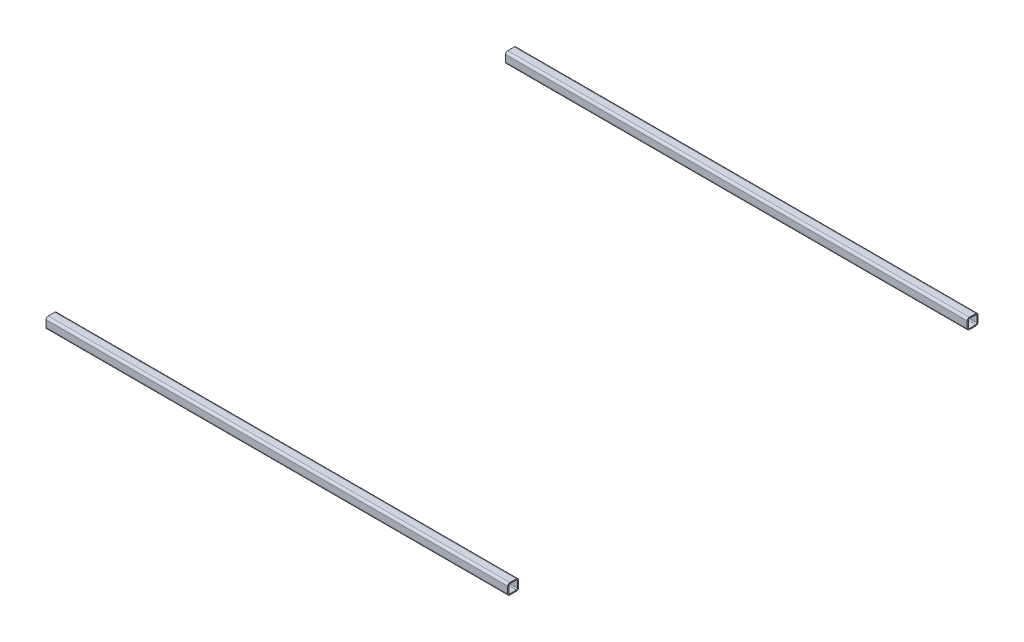
ISO-10303-21;
HEADER;
FILE_DESCRIPTION(('STEP AP214'),'2;1');
FILE_NAME('part.step','',(''),(''),'','','');
FILE_SCHEMA(('AUTOMOTIVE_DESIGN { 1 0 10303 214 1 1 1 1 }'));
ENDSEC;
DATA;
#1=APPLICATION_CONTEXT('core data for automotive mechanical design processes');
#2=APPLICATION_PROTOCOL_DEFINITION('international standard','automotive_design',2000,#1);
#3=PRODUCT_CONTEXT('',#1,'mechanical');
#4=PRODUCT('Part','Part','',(#3));
#5=PRODUCT_RELATED_PRODUCT_CATEGORY('part','',(#4));
#6=PRODUCT_DEFINITION_FORMATION('','',#4);
#7=PRODUCT_DEFINITION_CONTEXT('part definition',#1,'design');
#8=PRODUCT_DEFINITION('design','',#6,#7);
#9=PRODUCT_DEFINITION_SHAPE('','',#8);
#10=(LENGTH_UNIT() NAMED_UNIT(*) SI_UNIT(.MILLI.,.METRE.));
#11=(NAMED_UNIT(*) PLANE_ANGLE_UNIT() SI_UNIT($,.RADIAN.));
#12=(NAMED_UNIT(*) SI_UNIT($,.STERADIAN.) SOLID_ANGLE_UNIT());
#13=UNCERTAINTY_MEASURE_WITH_UNIT(LENGTH_MEASURE(1.E-05),#10,'distance_accuracy_value','');
#14=(GEOMETRIC_REPRESENTATION_CONTEXT(3) GLOBAL_UNCERTAINTY_ASSIGNED_CONTEXT((#13)) GLOBAL_UNIT_ASSIGNED_CONTEXT((#10,
#11,#12)) REPRESENTATION_CONTEXT('',''));
#15=CARTESIAN_POINT('',(0.,0.,0.));
#16=DIRECTION('',(0.,0.,1.));
#17=DIRECTION('',(1.,0.,0.));
#18=AXIS2_PLACEMENT_3D('',#15,#16,#17);
#19=CARTESIAN_POINT('',(-854.075,12.,862.011));
#20=DIRECTION('',(1.,0.,0.));
#21=DIRECTION('',(0.,0.,-1.));
#22=AXIS2_PLACEMENT_3D('',#19,#20,#21);
#23=CYLINDRICAL_SURFACE('',#22,8.);
#24=CARTESIAN_POINT('',(854.075,12.,862.011));
#25=DIRECTION('',(-1.,0.,0.));
#26=DIRECTION('',(0.,0.,1.));
#27=AXIS2_PLACEMENT_3D('',#24,#25,#26);
#28=CIRCLE('',#27,8.);
#29=CARTESIAN_POINT('',(854.075,12.,870.011));
#30=VERTEX_POINT('',#29);
#31=CARTESIAN_POINT('',(854.075,20.,862.011));
#32=VERTEX_POINT('',#31);
#33=EDGE_CURVE('E256',#30,#32,#28,.T.);
#34=ORIENTED_EDGE('',*,*,#33,.T.);
#35=DIRECTION('',(1.,0.,0.));
#36=VECTOR('',#35,1.);
#37=CARTESIAN_POINT('',(-854.075,20.,862.011));
#38=LINE('',#37,#36);
#39=CARTESIAN_POINT('',(-854.075,20.,862.011));
#40=VERTEX_POINT('',#39);
#41=EDGE_CURVE('E13',#40,#32,#38,.T.);
#42=ORIENTED_EDGE('',*,*,#41,.F.);
#43=CARTESIAN_POINT('',(-854.075,12.,862.011));
#44=DIRECTION('',(-1.,0.,0.));
#45=DIRECTION('',(0.,0.,1.));
#46=AXIS2_PLACEMENT_3D('',#43,#44,#45);
#47=CIRCLE('',#46,8.);
#48=CARTESIAN_POINT('',(-854.075,12.,870.011));
#49=VERTEX_POINT('',#48);
#50=EDGE_CURVE('E348',#49,#40,#47,.T.);
#51=ORIENTED_EDGE('',*,*,#50,.F.);
#52=DIRECTION('',(1.,0.,0.));
#53=VECTOR('',#52,1.);
#54=CARTESIAN_POINT('',(-854.075,12.,870.011));
#55=LINE('',#54,#53);
#56=EDGE_CURVE('E271',#49,#30,#55,.T.);
#57=ORIENTED_EDGE('',*,*,#56,.T.);
#58=EDGE_LOOP('',(#34,#42,#51,#57));
#59=FACE_BOUND('',#58,.T.);
#60=ADVANCED_FACE('F82',(#59),#23,.T.);
#61=CARTESIAN_POINT('',(-854.075,20.,862.011));
#62=DIRECTION('',(0.,-1.,0.));
#63=DIRECTION('',(0.,0.,-1.));
#64=AXIS2_PLACEMENT_3D('',#61,#62,#63);
#65=PLANE('',#64);
#66=DIRECTION('',(0.,0.,-1.));
#67=VECTOR('',#66,1.);
#68=CARTESIAN_POINT('',(854.075,20.,862.011));
#69=LINE('',#68,#67);
#70=CARTESIAN_POINT('',(854.075,20.,838.011));
#71=VERTEX_POINT('',#70);
#72=EDGE_CURVE('E259',#32,#71,#69,.T.);
#73=ORIENTED_EDGE('',*,*,#72,.T.);
#74=DIRECTION('',(1.,0.,0.));
#75=VECTOR('',#74,1.);
#76=CARTESIAN_POINT('',(-854.075,20.,838.011));
#77=LINE('',#76,#75);
#78=CARTESIAN_POINT('',(-854.075,20.,838.011));
#79=VERTEX_POINT('',#78);
#80=EDGE_CURVE('E93',#79,#71,#77,.T.);
#81=ORIENTED_EDGE('',*,*,#80,.F.);
#82=DIRECTION('',(0.,0.,-1.));
#83=VECTOR('',#82,1.);
#84=CARTESIAN_POINT('',(-854.075,20.,862.011));
#85=LINE('',#84,#83);
#86=EDGE_CURVE('E350',#40,#79,#85,.T.);
#87=ORIENTED_EDGE('',*,*,#86,.F.);
#88=ORIENTED_EDGE('',*,*,#41,.T.);
#89=EDGE_LOOP('',(#73,#81,#87,#88));
#90=FACE_BOUND('',#89,.T.);
#91=ADVANCED_FACE('F385',(#90),#65,.F.);
#92=CARTESIAN_POINT('',(-854.075,12.,838.011));
#93=DIRECTION('',(1.,0.,0.));
#94=DIRECTION('',(0.,0.,-1.));
#95=AXIS2_PLACEMENT_3D('',#92,#93,#94);
#96=CYLINDRICAL_SURFACE('',#95,8.);
#97=CARTESIAN_POINT('',(854.075,12.,838.011));
#98=DIRECTION('',(-1.,0.,0.));
#99=DIRECTION('',(0.,0.,1.));
#100=AXIS2_PLACEMENT_3D('',#97,#98,#99);
#101=CIRCLE('',#100,8.);
#102=CARTESIAN_POINT('',(854.075,12.,830.011));
#103=VERTEX_POINT('',#102);
#104=EDGE_CURVE('E261',#71,#103,#101,.T.);
#105=ORIENTED_EDGE('',*,*,#104,.T.);
#106=DIRECTION('',(1.,0.,0.));
#107=VECTOR('',#106,1.);
#108=CARTESIAN_POINT('',(-854.075,12.,830.011));
#109=LINE('',#108,#107);
#110=CARTESIAN_POINT('',(-854.075,12.,830.011));
#111=VERTEX_POINT('',#110);
#112=EDGE_CURVE('E282',#111,#103,#109,.T.);
#113=ORIENTED_EDGE('',*,*,#112,.F.);
#114=CARTESIAN_POINT('',(-854.075,12.,838.011));
#115=DIRECTION('',(-1.,0.,0.));
#116=DIRECTION('',(0.,0.,1.));
#117=AXIS2_PLACEMENT_3D('',#114,#115,#116);
#118=CIRCLE('',#117,8.);
#119=EDGE_CURVE('E352',#79,#111,#118,.T.);
#120=ORIENTED_EDGE('',*,*,#119,.F.);
#121=ORIENTED_EDGE('',*,*,#80,.T.);
#122=EDGE_LOOP('',(#105,#113,#120,#121));
#123=FACE_BOUND('',#122,.T.);
#124=ADVANCED_FACE('F390',(#123),#96,.T.);
#125=CARTESIAN_POINT('',(-854.075,-12.,830.011));
#126=DIRECTION('',(0.,0.,1.));
#127=DIRECTION('',(1.,0.,0.));
#128=AXIS2_PLACEMENT_3D('',#125,#126,#127);
#129=PLANE('',#128);
#130=DIRECTION('',(0.,-1.,0.));
#131=VECTOR('',#130,1.);
#132=CARTESIAN_POINT('',(854.075,-12.,830.011));
#133=LINE('',#132,#131);
#134=CARTESIAN_POINT('',(854.075,-12.,830.011));
#135=VERTEX_POINT('',#134);
#136=EDGE_CURVE('E263',#103,#135,#133,.T.);
#137=ORIENTED_EDGE('',*,*,#136,.T.);
#138=DIRECTION('',(1.,0.,0.));
#139=VECTOR('',#138,1.);
#140=CARTESIAN_POINT('',(-854.075,-12.,830.011));
#141=LINE('',#140,#139);
#142=CARTESIAN_POINT('',(-854.075,-12.,830.011));
#143=VERTEX_POINT('',#142);
#144=EDGE_CURVE('E278',#143,#135,#141,.T.);
#145=ORIENTED_EDGE('',*,*,#144,.F.);
#146=DIRECTION('',(0.,-1.,0.));
#147=VECTOR('',#146,1.);
#148=CARTESIAN_POINT('',(-854.075,-12.,830.011));
#149=LINE('',#148,#147);
#150=EDGE_CURVE('E354',#111,#143,#149,.T.);
#151=ORIENTED_EDGE('',*,*,#150,.F.);
#152=ORIENTED_EDGE('',*,*,#112,.T.);
#153=EDGE_LOOP('',(#137,#145,#151,#152));
#154=FACE_BOUND('',#153,.T.);
#155=ADVANCED_FACE('F360',(#154),#129,.F.);
#156=CARTESIAN_POINT('',(-854.075,-12.,838.011));
#157=DIRECTION('',(1.,0.,0.));
#158=DIRECTION('',(0.,0.,-1.));
#159=AXIS2_PLACEMENT_3D('',#156,#157,#158);
#160=CYLINDRICAL_SURFACE('',#159,8.);
#161=CARTESIAN_POINT('',(854.075,-12.,838.011));
#162=DIRECTION('',(-1.,0.,0.));
#163=DIRECTION('',(0.,0.,1.));
#164=AXIS2_PLACEMENT_3D('',#161,#162,#163);
#165=CIRCLE('',#164,8.);
#166=CARTESIAN_POINT('',(854.075,-20.,838.011));
#167=VERTEX_POINT('',#166);
#168=EDGE_CURVE('E265',#135,#167,#165,.T.);
#169=ORIENTED_EDGE('',*,*,#168,.T.);
#170=DIRECTION('',(1.,0.,0.));
#171=VECTOR('',#170,1.);
#172=CARTESIAN_POINT('',(-854.075,-20.,838.011));
#173=LINE('',#172,#171);
#174=CARTESIAN_POINT('',(-854.075,-20.,838.011));
#175=VERTEX_POINT('',#174);
#176=EDGE_CURVE('E223',#175,#167,#173,.T.);
#177=ORIENTED_EDGE('',*,*,#176,.F.);
#178=CARTESIAN_POINT('',(-854.075,-12.,838.011));
#179=DIRECTION('',(-1.,0.,0.));
#180=DIRECTION('',(0.,0.,1.));
#181=AXIS2_PLACEMENT_3D('',#178,#179,#180);
#182=CIRCLE('',#181,8.);
#183=EDGE_CURVE('E213',#143,#175,#182,.T.);
#184=ORIENTED_EDGE('',*,*,#183,.F.);
#185=ORIENTED_EDGE('',*,*,#144,.T.);
#186=EDGE_LOOP('',(#169,#177,#184,#185));
#187=FACE_BOUND('',#186,.T.);
#188=ADVANCED_FACE('F364',(#187),#160,.T.);
#189=CARTESIAN_POINT('',(-854.075,-20.,838.011));
#190=DIRECTION('',(0.,1.,0.));
#191=DIRECTION('',(0.,0.,1.));
#192=AXIS2_PLACEMENT_3D('',#189,#190,#191);
#193=PLANE('',#192);
#194=DIRECTION('',(0.,0.,1.));
#195=VECTOR('',#194,1.);
#196=CARTESIAN_POINT('',(854.075,-20.,838.011));
#197=LINE('',#196,#195);
#198=CARTESIAN_POINT('',(854.075,-20.,862.011));
#199=VERTEX_POINT('',#198);
#200=EDGE_CURVE('E221',#167,#199,#197,.T.);
#201=ORIENTED_EDGE('',*,*,#200,.T.);
#202=DIRECTION('',(1.,0.,0.));
#203=VECTOR('',#202,1.);
#204=CARTESIAN_POINT('',(-854.075,-20.,862.011));
#205=LINE('',#204,#203);
#206=CARTESIAN_POINT('',(-854.075,-20.,862.011));
#207=VERTEX_POINT('',#206);
#208=EDGE_CURVE('E218',#207,#199,#205,.T.);
#209=ORIENTED_EDGE('',*,*,#208,.F.);
#210=DIRECTION('',(0.,0.,1.));
#211=VECTOR('',#210,1.);
#212=CARTESIAN_POINT('',(-854.075,-20.,838.011));
#213=LINE('',#212,#211);
#214=EDGE_CURVE('E207',#175,#207,#213,.T.);
#215=ORIENTED_EDGE('',*,*,#214,.F.);
#216=ORIENTED_EDGE('',*,*,#176,.T.);
#217=EDGE_LOOP('',(#201,#209,#215,#216));
#218=FACE_BOUND('',#217,.T.);
#219=ADVANCED_FACE('F219',(#218),#193,.F.);
#220=CARTESIAN_POINT('',(-854.075,-12.,862.011));
#221=DIRECTION('',(1.,0.,0.));
#222=DIRECTION('',(0.,0.,-1.));
#223=AXIS2_PLACEMENT_3D('',#220,#221,#222);
#224=CYLINDRICAL_SURFACE('',#223,8.);
#225=CARTESIAN_POINT('',(854.075,-12.,862.011));
#226=DIRECTION('',(-1.,0.,0.));
#227=DIRECTION('',(0.,0.,1.));
#228=AXIS2_PLACEMENT_3D('',#225,#226,#227);
#229=CIRCLE('',#228,8.);
#230=CARTESIAN_POINT('',(854.075,-12.,870.011));
#231=VERTEX_POINT('',#230);
#232=EDGE_CURVE('E155',#199,#231,#229,.T.);
#233=ORIENTED_EDGE('',*,*,#232,.T.);
#234=DIRECTION('',(1.,0.,0.));
#235=VECTOR('',#234,1.);
#236=CARTESIAN_POINT('',(-854.075,-12.,870.011));
#237=LINE('',#236,#235);
#238=CARTESIAN_POINT('',(-854.075,-12.,870.011));
#239=VERTEX_POINT('',#238);
#240=EDGE_CURVE('E224',#239,#231,#237,.T.);
#241=ORIENTED_EDGE('',*,*,#240,.F.);
#242=CARTESIAN_POINT('',(-854.075,-12.,862.011));
#243=DIRECTION('',(-1.,0.,0.));
#244=DIRECTION('',(0.,0.,1.));
#245=AXIS2_PLACEMENT_3D('',#242,#243,#244);
#246=CIRCLE('',#245,8.);
#247=EDGE_CURVE('E211',#207,#239,#246,.T.);
#248=ORIENTED_EDGE('',*,*,#247,.F.);
#249=ORIENTED_EDGE('',*,*,#208,.T.);
#250=EDGE_LOOP('',(#233,#241,#248,#249));
#251=FACE_BOUND('',#250,.T.);
#252=ADVANCED_FACE('F226',(#251),#224,.T.);
#253=CARTESIAN_POINT('',(-854.075,12.,838.011));
#254=DIRECTION('',(1.,0.,0.));
#255=DIRECTION('',(0.,0.,-1.));
#256=AXIS2_PLACEMENT_3D('',#253,#254,#255);
#257=CYLINDRICAL_SURFACE('',#256,4.);
#258=CARTESIAN_POINT('',(854.075,12.,838.011));
#259=DIRECTION('',(-1.,0.,0.));
#260=DIRECTION('',(0.,0.,1.));
#261=AXIS2_PLACEMENT_3D('',#258,#259,#260);
#262=CIRCLE('',#261,4.);
#263=CARTESIAN_POINT('',(854.075,16.,838.011));
#264=VERTEX_POINT('',#263);
#265=CARTESIAN_POINT('',(854.075,12.,834.011));
#266=VERTEX_POINT('',#265);
#267=EDGE_CURVE('E232',#264,#266,#262,.T.);
#268=ORIENTED_EDGE('',*,*,#267,.F.);
#269=DIRECTION('',(1.,0.,0.));
#270=VECTOR('',#269,1.);
#271=CARTESIAN_POINT('',(-854.075,16.,838.011));
#272=LINE('',#271,#270);
#273=CARTESIAN_POINT('',(-854.075,16.,838.011));
#274=VERTEX_POINT('',#273);
#275=EDGE_CURVE('E86',#274,#264,#272,.T.);
#276=ORIENTED_EDGE('',*,*,#275,.F.);
#277=CARTESIAN_POINT('',(-854.075,12.,838.011));
#278=DIRECTION('',(-1.,0.,0.));
#279=DIRECTION('',(0.,0.,1.));
#280=AXIS2_PLACEMENT_3D('',#277,#278,#279);
#281=CIRCLE('',#280,4.);
#282=CARTESIAN_POINT('',(-854.075,12.,834.011));
#283=VERTEX_POINT('',#282);
#284=EDGE_CURVE('E270',#274,#283,#281,.T.);
#285=ORIENTED_EDGE('',*,*,#284,.T.);
#286=DIRECTION('',(1.,0.,0.));
#287=VECTOR('',#286,1.);
#288=CARTESIAN_POINT('',(-854.075,12.,834.011));
#289=LINE('',#288,#287);
#290=EDGE_CURVE('E228',#283,#266,#289,.T.);
#291=ORIENTED_EDGE('',*,*,#290,.T.);
#292=EDGE_LOOP('',(#268,#276,#285,#291));
#293=FACE_BOUND('',#292,.T.);
#294=ADVANCED_FACE('F84',(#293),#257,.F.);
#295=CARTESIAN_POINT('',(-854.075,16.,862.011));
#296=DIRECTION('',(0.,-1.,0.));
#297=DIRECTION('',(0.,0.,-1.));
#298=AXIS2_PLACEMENT_3D('',#295,#296,#297);
#299=PLANE('',#298);
#300=DIRECTION('',(0.,0.,-1.));
#301=VECTOR('',#300,1.);
#302=CARTESIAN_POINT('',(854.075,16.,862.011));
#303=LINE('',#302,#301);
#304=CARTESIAN_POINT('',(854.075,16.,862.011));
#305=VERTEX_POINT('',#304);
#306=EDGE_CURVE('E235',#305,#264,#303,.T.);
#307=ORIENTED_EDGE('',*,*,#306,.F.);
#308=DIRECTION('',(1.,0.,0.));
#309=VECTOR('',#308,1.);
#310=CARTESIAN_POINT('',(-854.075,16.,862.011));
#311=LINE('',#310,#309);
#312=CARTESIAN_POINT('',(-854.075,16.,862.011));
#313=VERTEX_POINT('',#312);
#314=EDGE_CURVE('E305',#313,#305,#311,.T.);
#315=ORIENTED_EDGE('',*,*,#314,.F.);
#316=DIRECTION('',(0.,0.,-1.));
#317=VECTOR('',#316,1.);
#318=CARTESIAN_POINT('',(-854.075,16.,862.011));
#319=LINE('',#318,#317);
#320=EDGE_CURVE('E316',#313,#274,#319,.T.);
#321=ORIENTED_EDGE('',*,*,#320,.T.);
#322=ORIENTED_EDGE('',*,*,#275,.T.);
#323=EDGE_LOOP('',(#307,#315,#321,#322));
#324=FACE_BOUND('',#323,.T.);
#325=ADVANCED_FACE('F314',(#324),#299,.T.);
#326=CARTESIAN_POINT('',(-854.075,12.,862.011));
#327=DIRECTION('',(1.,0.,0.));
#328=DIRECTION('',(0.,0.,-1.));
#329=AXIS2_PLACEMENT_3D('',#326,#327,#328);
#330=CYLINDRICAL_SURFACE('',#329,4.);
#331=CARTESIAN_POINT('',(854.075,12.,862.011));
#332=DIRECTION('',(-1.,0.,0.));
#333=DIRECTION('',(0.,0.,1.));
#334=AXIS2_PLACEMENT_3D('',#331,#332,#333);
#335=CIRCLE('',#334,4.);
#336=CARTESIAN_POINT('',(854.075,12.,866.011));
#337=VERTEX_POINT('',#336);
#338=EDGE_CURVE('E238',#337,#305,#335,.T.);
#339=ORIENTED_EDGE('',*,*,#338,.F.);
#340=DIRECTION('',(1.,0.,0.));
#341=VECTOR('',#340,1.);
#342=CARTESIAN_POINT('',(-854.075,12.,866.011));
#343=LINE('',#342,#341);
#344=CARTESIAN_POINT('',(-854.075,12.,866.011));
#345=VERTEX_POINT('',#344);
#346=EDGE_CURVE('E303',#345,#337,#343,.T.);
#347=ORIENTED_EDGE('',*,*,#346,.F.);
#348=CARTESIAN_POINT('',(-854.075,12.,862.011));
#349=DIRECTION('',(-1.,0.,0.));
#350=DIRECTION('',(0.,0.,1.));
#351=AXIS2_PLACEMENT_3D('',#348,#349,#350);
#352=CIRCLE('',#351,4.);
#353=EDGE_CURVE('E324',#345,#313,#352,.T.);
#354=ORIENTED_EDGE('',*,*,#353,.T.);
#355=ORIENTED_EDGE('',*,*,#314,.T.);
#356=EDGE_LOOP('',(#339,#347,#354,#355));
#357=FACE_BOUND('',#356,.T.);
#358=ADVANCED_FACE('F322',(#357),#330,.F.);
#359=CARTESIAN_POINT('',(-854.075,12.,866.011));
#360=DIRECTION('',(0.,0.,-1.));
#361=DIRECTION('',(-1.,0.,0.));
#362=AXIS2_PLACEMENT_3D('',#359,#360,#361);
#363=PLANE('',#362);
#364=DIRECTION('',(0.,1.,0.));
#365=VECTOR('',#364,1.);
#366=CARTESIAN_POINT('',(854.075,12.,866.011));
#367=LINE('',#366,#365);
#368=CARTESIAN_POINT('',(854.075,-12.,866.011));
#369=VERTEX_POINT('',#368);
#370=EDGE_CURVE('E241',#369,#337,#367,.T.);
#371=ORIENTED_EDGE('',*,*,#370,.F.);
#372=DIRECTION('',(1.,0.,0.));
#373=VECTOR('',#372,1.);
#374=CARTESIAN_POINT('',(-854.075,-12.,866.011));
#375=LINE('',#374,#373);
#376=CARTESIAN_POINT('',(-854.075,-12.,866.011));
#377=VERTEX_POINT('',#376);
#378=EDGE_CURVE('E300',#377,#369,#375,.T.);
#379=ORIENTED_EDGE('',*,*,#378,.F.);
#380=DIRECTION('',(0.,1.,0.));
#381=VECTOR('',#380,1.);
#382=CARTESIAN_POINT('',(-854.075,12.,866.011));
#383=LINE('',#382,#381);
#384=EDGE_CURVE('E330',#377,#345,#383,.T.);
#385=ORIENTED_EDGE('',*,*,#384,.T.);
#386=ORIENTED_EDGE('',*,*,#346,.T.);
#387=EDGE_LOOP('',(#371,#379,#385,#386));
#388=FACE_BOUND('',#387,.T.);
#389=ADVANCED_FACE('F333',(#388),#363,.T.);
#390=CARTESIAN_POINT('',(-854.075,-12.,862.011));
#391=DIRECTION('',(1.,0.,0.));
#392=DIRECTION('',(0.,0.,-1.));
#393=AXIS2_PLACEMENT_3D('',#390,#391,#392);
#394=CYLINDRICAL_SURFACE('',#393,4.);
#395=CARTESIAN_POINT('',(854.075,-12.,862.011));
#396=DIRECTION('',(-1.,0.,0.));
#397=DIRECTION('',(0.,0.,1.));
#398=AXIS2_PLACEMENT_3D('',#395,#396,#397);
#399=CIRCLE('',#398,4.);
#400=CARTESIAN_POINT('',(854.075,-16.,862.011));
#401=VERTEX_POINT('',#400);
#402=EDGE_CURVE('E244',#401,#369,#399,.T.);
#403=ORIENTED_EDGE('',*,*,#402,.F.);
#404=DIRECTION('',(1.,0.,0.));
#405=VECTOR('',#404,1.);
#406=CARTESIAN_POINT('',(-854.075,-16.,862.011));
#407=LINE('',#406,#405);
#408=CARTESIAN_POINT('',(-854.075,-16.,862.011));
#409=VERTEX_POINT('',#408);
#410=EDGE_CURVE('E297',#409,#401,#407,.T.);
#411=ORIENTED_EDGE('',*,*,#410,.F.);
#412=CARTESIAN_POINT('',(-854.075,-12.,862.011));
#413=DIRECTION('',(-1.,0.,0.));
#414=DIRECTION('',(0.,0.,1.));
#415=AXIS2_PLACEMENT_3D('',#412,#413,#414);
#416=CIRCLE('',#415,4.);
#417=EDGE_CURVE('E334',#409,#377,#416,.T.);
#418=ORIENTED_EDGE('',*,*,#417,.T.);
#419=ORIENTED_EDGE('',*,*,#378,.T.);
#420=EDGE_LOOP('',(#403,#411,#418,#419));
#421=FACE_BOUND('',#420,.T.);
#422=ADVANCED_FACE('F401',(#421),#394,.F.);
#423=CARTESIAN_POINT('',(-854.075,-16.,838.011));
#424=DIRECTION('',(0.,1.,0.));
#425=DIRECTION('',(0.,0.,1.));
#426=AXIS2_PLACEMENT_3D('',#423,#424,#425);
#427=PLANE('',#426);
#428=DIRECTION('',(0.,0.,1.));
#429=VECTOR('',#428,1.);
#430=CARTESIAN_POINT('',(854.075,-16.,838.011));
#431=LINE('',#430,#429);
#432=CARTESIAN_POINT('',(854.075,-16.,838.011));
#433=VERTEX_POINT('',#432);
#434=EDGE_CURVE('E247',#433,#401,#431,.T.);
#435=ORIENTED_EDGE('',*,*,#434,.F.);
#436=DIRECTION('',(1.,0.,0.));
#437=VECTOR('',#436,1.);
#438=CARTESIAN_POINT('',(-854.075,-16.,838.011));
#439=LINE('',#438,#437);
#440=CARTESIAN_POINT('',(-854.075,-16.,838.011));
#441=VERTEX_POINT('',#440);
#442=EDGE_CURVE('E294',#441,#433,#439,.T.);
#443=ORIENTED_EDGE('',*,*,#442,.F.);
#444=DIRECTION('',(0.,0.,1.));
#445=VECTOR('',#444,1.);
#446=CARTESIAN_POINT('',(-854.075,-16.,838.011));
#447=LINE('',#446,#445);
#448=EDGE_CURVE('E336',#441,#409,#447,.T.);
#449=ORIENTED_EDGE('',*,*,#448,.T.);
#450=ORIENTED_EDGE('',*,*,#410,.T.);
#451=EDGE_LOOP('',(#435,#443,#449,#450));
#452=FACE_BOUND('',#451,.T.);
#453=ADVANCED_FACE('F397',(#452),#427,.T.);
#454=CARTESIAN_POINT('',(-854.075,-12.,838.011));
#455=DIRECTION('',(1.,0.,0.));
#456=DIRECTION('',(0.,0.,-1.));
#457=AXIS2_PLACEMENT_3D('',#454,#455,#456);
#458=CYLINDRICAL_SURFACE('',#457,4.);
#459=CARTESIAN_POINT('',(854.075,-12.,838.011));
#460=DIRECTION('',(-1.,0.,0.));
#461=DIRECTION('',(0.,0.,1.));
#462=AXIS2_PLACEMENT_3D('',#459,#460,#461);
#463=CIRCLE('',#462,4.);
#464=CARTESIAN_POINT('',(854.075,-12.,834.011));
#465=VERTEX_POINT('',#464);
#466=EDGE_CURVE('E250',#465,#433,#463,.T.);
#467=ORIENTED_EDGE('',*,*,#466,.F.);
#468=DIRECTION('',(1.,0.,0.));
#469=VECTOR('',#468,1.);
#470=CARTESIAN_POINT('',(-854.075,-12.,834.011));
#471=LINE('',#470,#469);
#472=CARTESIAN_POINT('',(-854.075,-12.,834.011));
#473=VERTEX_POINT('',#472);
#474=EDGE_CURVE('E291',#473,#465,#471,.T.);
#475=ORIENTED_EDGE('',*,*,#474,.F.);
#476=CARTESIAN_POINT('',(-854.075,-12.,838.011));
#477=DIRECTION('',(-1.,0.,0.));
#478=DIRECTION('',(0.,0.,1.));
#479=AXIS2_PLACEMENT_3D('',#476,#477,#478);
#480=CIRCLE('',#479,4.);
#481=EDGE_CURVE('E342',#473,#441,#480,.T.);
#482=ORIENTED_EDGE('',*,*,#481,.T.);
#483=ORIENTED_EDGE('',*,*,#442,.T.);
#484=EDGE_LOOP('',(#467,#475,#482,#483));
#485=FACE_BOUND('',#484,.T.);
#486=ADVANCED_FACE('F379',(#485),#458,.F.);
#487=CARTESIAN_POINT('',(-854.075,-12.,834.011));
#488=DIRECTION('',(0.,0.,1.));
#489=DIRECTION('',(1.,0.,0.));
#490=AXIS2_PLACEMENT_3D('',#487,#488,#489);
#491=PLANE('',#490);
#492=DIRECTION('',(0.,-1.,0.));
#493=VECTOR('',#492,1.);
#494=CARTESIAN_POINT('',(854.075,-12.,834.011));
#495=LINE('',#494,#493);
#496=EDGE_CURVE('E253',#266,#465,#495,.T.);
#497=ORIENTED_EDGE('',*,*,#496,.F.);
#498=ORIENTED_EDGE('',*,*,#290,.F.);
#499=DIRECTION('',(0.,-1.,0.));
#500=VECTOR('',#499,1.);
#501=CARTESIAN_POINT('',(-854.075,-12.,834.011));
#502=LINE('',#501,#500);
#503=EDGE_CURVE('E345',#283,#473,#502,.T.);
#504=ORIENTED_EDGE('',*,*,#503,.T.);
#505=ORIENTED_EDGE('',*,*,#474,.T.);
#506=EDGE_LOOP('',(#497,#498,#504,#505));
#507=FACE_BOUND('',#506,.T.);
#508=ADVANCED_FACE('F372',(#507),#491,.T.);
#509=CARTESIAN_POINT('',(-854.075,12.,870.011));
#510=DIRECTION('',(0.,0.,-1.));
#511=DIRECTION('',(-1.,0.,0.));
#512=AXIS2_PLACEMENT_3D('',#509,#510,#511);
#513=PLANE('',#512);
#514=DIRECTION('',(0.,1.,0.));
#515=VECTOR('',#514,1.);
#516=CARTESIAN_POINT('',(854.075,12.,870.011));
#517=LINE('',#516,#515);
#518=EDGE_CURVE('E161',#231,#30,#517,.T.);
#519=ORIENTED_EDGE('',*,*,#518,.T.);
#520=ORIENTED_EDGE('',*,*,#56,.F.);
#521=DIRECTION('',(0.,1.,0.));
#522=VECTOR('',#521,1.);
#523=CARTESIAN_POINT('',(-854.075,12.,870.011));
#524=LINE('',#523,#522);
#525=EDGE_CURVE('E102',#239,#49,#524,.T.);
#526=ORIENTED_EDGE('',*,*,#525,.F.);
#527=ORIENTED_EDGE('',*,*,#240,.T.);
#528=EDGE_LOOP('',(#519,#520,#526,#527));
#529=FACE_BOUND('',#528,.T.);
#530=ADVANCED_FACE('F370',(#529),#513,.F.);
#531=CARTESIAN_POINT('',(-854.075,12.,862.011));
#532=DIRECTION('',(-1.,0.,0.));
#533=DIRECTION('',(0.,0.,1.));
#534=AXIS2_PLACEMENT_3D('',#531,#532,#533);
#535=PLANE('',#534);
#536=ORIENTED_EDGE('',*,*,#284,.F.);
#537=ORIENTED_EDGE('',*,*,#320,.F.);
#538=ORIENTED_EDGE('',*,*,#353,.F.);
#539=ORIENTED_EDGE('',*,*,#384,.F.);
#540=ORIENTED_EDGE('',*,*,#417,.F.);
#541=ORIENTED_EDGE('',*,*,#448,.F.);
#542=ORIENTED_EDGE('',*,*,#481,.F.);
#543=ORIENTED_EDGE('',*,*,#503,.F.);
#544=EDGE_LOOP('',(#536,#537,#538,#539,#540,#541,#542,#543));
#545=FACE_BOUND('',#544,.T.);
#546=ORIENTED_EDGE('',*,*,#50,.T.);
#547=ORIENTED_EDGE('',*,*,#86,.T.);
#548=ORIENTED_EDGE('',*,*,#119,.T.);
#549=ORIENTED_EDGE('',*,*,#150,.T.);
#550=ORIENTED_EDGE('',*,*,#183,.T.);
#551=ORIENTED_EDGE('',*,*,#214,.T.);
#552=ORIENTED_EDGE('',*,*,#247,.T.);
#553=ORIENTED_EDGE('',*,*,#525,.T.);
#554=EDGE_LOOP('',(#546,#547,#548,#549,#550,#551,#552,#553));
#555=FACE_BOUND('',#554,.T.);
#556=ADVANCED_FACE('F209',(#545,#555),#535,.T.);
#557=CARTESIAN_POINT('',(854.075,12.,862.011));
#558=DIRECTION('',(-1.,0.,0.));
#559=DIRECTION('',(0.,0.,1.));
#560=AXIS2_PLACEMENT_3D('',#557,#558,#559);
#561=PLANE('',#560);
#562=ORIENTED_EDGE('',*,*,#267,.T.);
#563=ORIENTED_EDGE('',*,*,#496,.T.);
#564=ORIENTED_EDGE('',*,*,#466,.T.);
#565=ORIENTED_EDGE('',*,*,#434,.T.);
#566=ORIENTED_EDGE('',*,*,#402,.T.);
#567=ORIENTED_EDGE('',*,*,#370,.T.);
#568=ORIENTED_EDGE('',*,*,#338,.T.);
#569=ORIENTED_EDGE('',*,*,#306,.T.);
#570=EDGE_LOOP('',(#562,#563,#564,#565,#566,#567,#568,#569));
#571=FACE_BOUND('',#570,.T.);
#572=ORIENTED_EDGE('',*,*,#33,.F.);
#573=ORIENTED_EDGE('',*,*,#518,.F.);
#574=ORIENTED_EDGE('',*,*,#232,.F.);
#575=ORIENTED_EDGE('',*,*,#200,.F.);
#576=ORIENTED_EDGE('',*,*,#168,.F.);
#577=ORIENTED_EDGE('',*,*,#136,.F.);
#578=ORIENTED_EDGE('',*,*,#104,.F.);
#579=ORIENTED_EDGE('',*,*,#72,.F.);
#580=EDGE_LOOP('',(#572,#573,#574,#575,#576,#577,#578,#579));
#581=FACE_BOUND('',#580,.T.);
#582=ADVANCED_FACE('F319',(#571,#581),#561,.F.);
#583=CLOSED_SHELL('',(#60,#91,#124,#155,#188,#219,#252,#294,#325,#358,#389,#422,#453,#486,#508,
#530,#556,#582));
#584=MANIFOLD_SOLID_BREP('B2',#583);
#585=CARTESIAN_POINT('',(-854.075,12.,-838.011));
#586=DIRECTION('',(1.,0.,0.));
#587=DIRECTION('',(0.,0.,-1.));
#588=AXIS2_PLACEMENT_3D('',#585,#586,#587);
#589=CYLINDRICAL_SURFACE('',#588,8.);
#590=CARTESIAN_POINT('',(854.075,12.,-838.011));
#591=DIRECTION('',(-1.,0.,0.));
#592=DIRECTION('',(0.,0.,1.));
#593=AXIS2_PLACEMENT_3D('',#590,#591,#592);
#594=CIRCLE('',#593,8.);
#595=CARTESIAN_POINT('',(854.075,12.,-830.011));
#596=VERTEX_POINT('',#595);
#597=CARTESIAN_POINT('',(854.075,20.,-838.011));
#598=VERTEX_POINT('',#597);
#599=EDGE_CURVE('E811',#596,#598,#594,.T.);
#600=ORIENTED_EDGE('',*,*,#599,.T.);
#601=DIRECTION('',(1.,0.,0.));
#602=VECTOR('',#601,1.);
#603=CARTESIAN_POINT('',(-854.075,20.,-838.011));
#604=LINE('',#603,#602);
#605=CARTESIAN_POINT('',(-854.075,20.,-838.011));
#606=VERTEX_POINT('',#605);
#607=EDGE_CURVE('E80',#606,#598,#604,.T.);
#608=ORIENTED_EDGE('',*,*,#607,.F.);
#609=CARTESIAN_POINT('',(-854.075,12.,-838.011));
#610=DIRECTION('',(-1.,0.,0.));
#611=DIRECTION('',(0.,0.,1.));
#612=AXIS2_PLACEMENT_3D('',#609,#610,#611);
#613=CIRCLE('',#612,8.);
#614=CARTESIAN_POINT('',(-854.075,12.,-830.011));
#615=VERTEX_POINT('',#614);
#616=EDGE_CURVE('E911',#615,#606,#613,.T.);
#617=ORIENTED_EDGE('',*,*,#616,.F.);
#618=DIRECTION('',(1.,0.,0.));
#619=VECTOR('',#618,1.);
#620=CARTESIAN_POINT('',(-854.075,12.,-830.011));
#621=LINE('',#620,#619);
#622=EDGE_CURVE('E834',#615,#596,#621,.T.);
#623=ORIENTED_EDGE('',*,*,#622,.T.);
#624=EDGE_LOOP('',(#600,#608,#617,#623));
#625=FACE_BOUND('',#624,.T.);
#626=ADVANCED_FACE('F613',(#625),#589,.T.);
#627=CARTESIAN_POINT('',(-854.075,20.,-838.011));
#628=DIRECTION('',(0.,-1.,0.));
#629=DIRECTION('',(0.,0.,-1.));
#630=AXIS2_PLACEMENT_3D('',#627,#628,#629);
#631=PLANE('',#630);
#632=DIRECTION('',(0.,0.,-1.));
#633=VECTOR('',#632,1.);
#634=CARTESIAN_POINT('',(854.075,20.,-838.011));
#635=LINE('',#634,#633);
#636=CARTESIAN_POINT('',(854.075,20.,-862.011));
#637=VERTEX_POINT('',#636);
#638=EDGE_CURVE('E815',#598,#637,#635,.T.);
#639=ORIENTED_EDGE('',*,*,#638,.T.);
#640=DIRECTION('',(1.,0.,0.));
#641=VECTOR('',#640,1.);
#642=CARTESIAN_POINT('',(-854.075,20.,-862.011));
#643=LINE('',#642,#641);
#644=CARTESIAN_POINT('',(-854.075,20.,-862.011));
#645=VERTEX_POINT('',#644);
#646=EDGE_CURVE('E624',#645,#637,#643,.T.);
#647=ORIENTED_EDGE('',*,*,#646,.F.);
#648=DIRECTION('',(0.,0.,-1.));
#649=VECTOR('',#648,1.);
#650=CARTESIAN_POINT('',(-854.075,20.,-838.011));
#651=LINE('',#650,#649);
#652=EDGE_CURVE('E913',#606,#645,#651,.T.);
#653=ORIENTED_EDGE('',*,*,#652,.F.);
#654=ORIENTED_EDGE('',*,*,#607,.T.);
#655=EDGE_LOOP('',(#639,#647,#653,#654));
#656=FACE_BOUND('',#655,.T.);
#657=ADVANCED_FACE('F948',(#656),#631,.F.);
#658=CARTESIAN_POINT('',(-854.075,12.,-862.011));
#659=DIRECTION('',(1.,0.,0.));
#660=DIRECTION('',(0.,0.,-1.));
#661=AXIS2_PLACEMENT_3D('',#658,#659,#660);
#662=CYLINDRICAL_SURFACE('',#661,8.);
#663=CARTESIAN_POINT('',(854.075,12.,-862.011));
#664=DIRECTION('',(-1.,0.,0.));
#665=DIRECTION('',(0.,0.,1.));
#666=AXIS2_PLACEMENT_3D('',#663,#664,#665);
#667=CIRCLE('',#666,8.);
#668=CARTESIAN_POINT('',(854.075,12.,-870.011));
#669=VERTEX_POINT('',#668);
#670=EDGE_CURVE('E818',#637,#669,#667,.T.);
#671=ORIENTED_EDGE('',*,*,#670,.T.);
#672=DIRECTION('',(1.,0.,0.));
#673=VECTOR('',#672,1.);
#674=CARTESIAN_POINT('',(-854.075,12.,-870.011));
#675=LINE('',#674,#673);
#676=CARTESIAN_POINT('',(-854.075,12.,-870.011));
#677=VERTEX_POINT('',#676);
#678=EDGE_CURVE('E845',#677,#669,#675,.T.);
#679=ORIENTED_EDGE('',*,*,#678,.F.);
#680=CARTESIAN_POINT('',(-854.075,12.,-862.011));
#681=DIRECTION('',(-1.,0.,0.));
#682=DIRECTION('',(0.,0.,1.));
#683=AXIS2_PLACEMENT_3D('',#680,#681,#682);
#684=CIRCLE('',#683,8.);
#685=EDGE_CURVE('E915',#645,#677,#684,.T.);
#686=ORIENTED_EDGE('',*,*,#685,.F.);
#687=ORIENTED_EDGE('',*,*,#646,.T.);
#688=EDGE_LOOP('',(#671,#679,#686,#687));
#689=FACE_BOUND('',#688,.T.);
#690=ADVANCED_FACE('F953',(#689),#662,.T.);
#691=CARTESIAN_POINT('',(-854.075,-12.,-870.011));
#692=DIRECTION('',(0.,0.,1.));
#693=DIRECTION('',(1.,0.,0.));
#694=AXIS2_PLACEMENT_3D('',#691,#692,#693);
#695=PLANE('',#694);
#696=DIRECTION('',(0.,-1.,0.));
#697=VECTOR('',#696,1.);
#698=CARTESIAN_POINT('',(854.075,-12.,-870.011));
#699=LINE('',#698,#697);
#700=CARTESIAN_POINT('',(854.075,-12.,-870.011));
#701=VERTEX_POINT('',#700);
#702=EDGE_CURVE('E821',#669,#701,#699,.T.);
#703=ORIENTED_EDGE('',*,*,#702,.T.);
#704=DIRECTION('',(1.,0.,0.));
#705=VECTOR('',#704,1.);
#706=CARTESIAN_POINT('',(-854.075,-12.,-870.011));
#707=LINE('',#706,#705);
#708=CARTESIAN_POINT('',(-854.075,-12.,-870.011));
#709=VERTEX_POINT('',#708);
#710=EDGE_CURVE('E841',#709,#701,#707,.T.);
#711=ORIENTED_EDGE('',*,*,#710,.F.);
#712=DIRECTION('',(0.,-1.,0.));
#713=VECTOR('',#712,1.);
#714=CARTESIAN_POINT('',(-854.075,-12.,-870.011));
#715=LINE('',#714,#713);
#716=EDGE_CURVE('E917',#677,#709,#715,.T.);
#717=ORIENTED_EDGE('',*,*,#716,.F.);
#718=ORIENTED_EDGE('',*,*,#678,.T.);
#719=EDGE_LOOP('',(#703,#711,#717,#718));
#720=FACE_BOUND('',#719,.T.);
#721=ADVANCED_FACE('F923',(#720),#695,.F.);
#722=CARTESIAN_POINT('',(-854.075,-12.,-862.011));
#723=DIRECTION('',(1.,0.,0.));
#724=DIRECTION('',(0.,0.,-1.));
#725=AXIS2_PLACEMENT_3D('',#722,#723,#724);
#726=CYLINDRICAL_SURFACE('',#725,8.);
#727=CARTESIAN_POINT('',(854.075,-12.,-862.011));
#728=DIRECTION('',(-1.,0.,0.));
#729=DIRECTION('',(0.,0.,1.));
#730=AXIS2_PLACEMENT_3D('',#727,#728,#729);
#731=CIRCLE('',#730,8.);
#732=CARTESIAN_POINT('',(854.075,-20.,-862.011));
#733=VERTEX_POINT('',#732);
#734=EDGE_CURVE('E824',#701,#733,#731,.T.);
#735=ORIENTED_EDGE('',*,*,#734,.T.);
#736=DIRECTION('',(1.,0.,0.));
#737=VECTOR('',#736,1.);
#738=CARTESIAN_POINT('',(-854.075,-20.,-862.011));
#739=LINE('',#738,#737);
#740=CARTESIAN_POINT('',(-854.075,-20.,-862.011));
#741=VERTEX_POINT('',#740);
#742=EDGE_CURVE('E770',#741,#733,#739,.T.);
#743=ORIENTED_EDGE('',*,*,#742,.F.);
#744=CARTESIAN_POINT('',(-854.075,-12.,-862.011));
#745=DIRECTION('',(-1.,0.,0.));
#746=DIRECTION('',(0.,0.,1.));
#747=AXIS2_PLACEMENT_3D('',#744,#745,#746);
#748=CIRCLE('',#747,8.);
#749=EDGE_CURVE('E760',#709,#741,#748,.T.);
#750=ORIENTED_EDGE('',*,*,#749,.F.);
#751=ORIENTED_EDGE('',*,*,#710,.T.);
#752=EDGE_LOOP('',(#735,#743,#750,#751));
#753=FACE_BOUND('',#752,.T.);
#754=ADVANCED_FACE('F927',(#753),#726,.T.);
#755=CARTESIAN_POINT('',(-854.075,-20.,-862.011));
#756=DIRECTION('',(0.,1.,0.));
#757=DIRECTION('',(0.,0.,1.));
#758=AXIS2_PLACEMENT_3D('',#755,#756,#757);
#759=PLANE('',#758);
#760=DIRECTION('',(0.,0.,1.));
#761=VECTOR('',#760,1.);
#762=CARTESIAN_POINT('',(854.075,-20.,-862.011));
#763=LINE('',#762,#761);
#764=CARTESIAN_POINT('',(854.075,-20.,-838.011));
#765=VERTEX_POINT('',#764);
#766=EDGE_CURVE('E768',#733,#765,#763,.T.);
#767=ORIENTED_EDGE('',*,*,#766,.T.);
#768=DIRECTION('',(1.,0.,0.));
#769=VECTOR('',#768,1.);
#770=CARTESIAN_POINT('',(-854.075,-20.,-838.011));
#771=LINE('',#770,#769);
#772=CARTESIAN_POINT('',(-854.075,-20.,-838.011));
#773=VERTEX_POINT('',#772);
#774=EDGE_CURVE('E765',#773,#765,#771,.T.);
#775=ORIENTED_EDGE('',*,*,#774,.F.);
#776=DIRECTION('',(0.,0.,1.));
#777=VECTOR('',#776,1.);
#778=CARTESIAN_POINT('',(-854.075,-20.,-862.011));
#779=LINE('',#778,#777);
#780=EDGE_CURVE('E754',#741,#773,#779,.T.);
#781=ORIENTED_EDGE('',*,*,#780,.F.);
#782=ORIENTED_EDGE('',*,*,#742,.T.);
#783=EDGE_LOOP('',(#767,#775,#781,#782));
#784=FACE_BOUND('',#783,.T.);
#785=ADVANCED_FACE('F766',(#784),#759,.F.);
#786=CARTESIAN_POINT('',(-854.075,-12.,-838.011));
#787=DIRECTION('',(1.,0.,0.));
#788=DIRECTION('',(0.,0.,-1.));
#789=AXIS2_PLACEMENT_3D('',#786,#787,#788);
#790=CYLINDRICAL_SURFACE('',#789,8.);
#791=CARTESIAN_POINT('',(854.075,-12.,-838.011));
#792=DIRECTION('',(-1.,0.,0.));
#793=DIRECTION('',(0.,0.,1.));
#794=AXIS2_PLACEMENT_3D('',#791,#792,#793);
#795=CIRCLE('',#794,8.);
#796=CARTESIAN_POINT('',(854.075,-12.,-830.011));
#797=VERTEX_POINT('',#796);
#798=EDGE_CURVE('E701',#765,#797,#795,.T.);
#799=ORIENTED_EDGE('',*,*,#798,.T.);
#800=DIRECTION('',(1.,0.,0.));
#801=VECTOR('',#800,1.);
#802=CARTESIAN_POINT('',(-854.075,-12.,-830.011));
#803=LINE('',#802,#801);
#804=CARTESIAN_POINT('',(-854.075,-12.,-830.011));
#805=VERTEX_POINT('',#804);
#806=EDGE_CURVE('E771',#805,#797,#803,.T.);
#807=ORIENTED_EDGE('',*,*,#806,.F.);
#808=CARTESIAN_POINT('',(-854.075,-12.,-838.011));
#809=DIRECTION('',(-1.,0.,0.));
#810=DIRECTION('',(0.,0.,1.));
#811=AXIS2_PLACEMENT_3D('',#808,#809,#810);
#812=CIRCLE('',#811,8.);
#813=EDGE_CURVE('E758',#773,#805,#812,.T.);
#814=ORIENTED_EDGE('',*,*,#813,.F.);
#815=ORIENTED_EDGE('',*,*,#774,.T.);
#816=EDGE_LOOP('',(#799,#807,#814,#815));
#817=FACE_BOUND('',#816,.T.);
#818=ADVANCED_FACE('F773',(#817),#790,.T.);
#819=CARTESIAN_POINT('',(-854.075,12.,-862.011));
#820=DIRECTION('',(1.,0.,0.));
#821=DIRECTION('',(0.,0.,-1.));
#822=AXIS2_PLACEMENT_3D('',#819,#820,#821);
#823=CYLINDRICAL_SURFACE('',#822,4.);
#824=CARTESIAN_POINT('',(854.075,12.,-862.011));
#825=DIRECTION('',(-1.,0.,0.));
#826=DIRECTION('',(0.,0.,1.));
#827=AXIS2_PLACEMENT_3D('',#824,#825,#826);
#828=CIRCLE('',#827,4.);
#829=CARTESIAN_POINT('',(854.075,16.,-862.011));
#830=VERTEX_POINT('',#829);
#831=CARTESIAN_POINT('',(854.075,12.,-866.011));
#832=VERTEX_POINT('',#831);
#833=EDGE_CURVE('E779',#830,#832,#828,.T.);
#834=ORIENTED_EDGE('',*,*,#833,.F.);
#835=DIRECTION('',(1.,0.,0.));
#836=VECTOR('',#835,1.);
#837=CARTESIAN_POINT('',(-854.075,16.,-862.011));
#838=LINE('',#837,#836);
#839=CARTESIAN_POINT('',(-854.075,16.,-862.011));
#840=VERTEX_POINT('',#839);
#841=EDGE_CURVE('E617',#840,#830,#838,.T.);
#842=ORIENTED_EDGE('',*,*,#841,.F.);
#843=CARTESIAN_POINT('',(-854.075,12.,-862.011));
#844=DIRECTION('',(-1.,0.,0.));
#845=DIRECTION('',(0.,0.,1.));
#846=AXIS2_PLACEMENT_3D('',#843,#844,#845);
#847=CIRCLE('',#846,4.);
#848=CARTESIAN_POINT('',(-854.075,12.,-866.011));
#849=VERTEX_POINT('',#848);
#850=EDGE_CURVE('E833',#840,#849,#847,.T.);
#851=ORIENTED_EDGE('',*,*,#850,.T.);
#852=DIRECTION('',(1.,0.,0.));
#853=VECTOR('',#852,1.);
#854=CARTESIAN_POINT('',(-854.075,12.,-866.011));
#855=LINE('',#854,#853);
#856=EDGE_CURVE('E775',#849,#832,#855,.T.);
#857=ORIENTED_EDGE('',*,*,#856,.T.);
#858=EDGE_LOOP('',(#834,#842,#851,#857));
#859=FACE_BOUND('',#858,.T.);
#860=ADVANCED_FACE('F615',(#859),#823,.F.);
#861=CARTESIAN_POINT('',(-854.075,16.,-838.011));
#862=DIRECTION('',(0.,-1.,0.));
#863=DIRECTION('',(0.,0.,-1.));
#864=AXIS2_PLACEMENT_3D('',#861,#862,#863);
#865=PLANE('',#864);
#866=DIRECTION('',(0.,0.,-1.));
#867=VECTOR('',#866,1.);
#868=CARTESIAN_POINT('',(854.075,16.,-838.011));
#869=LINE('',#868,#867);
#870=CARTESIAN_POINT('',(854.075,16.,-838.011));
#871=VERTEX_POINT('',#870);
#872=EDGE_CURVE('E783',#871,#830,#869,.T.);
#873=ORIENTED_EDGE('',*,*,#872,.F.);
#874=DIRECTION('',(1.,0.,0.));
#875=VECTOR('',#874,1.);
#876=CARTESIAN_POINT('',(-854.075,16.,-838.011));
#877=LINE('',#876,#875);
#878=CARTESIAN_POINT('',(-854.075,16.,-838.011));
#879=VERTEX_POINT('',#878);
#880=EDGE_CURVE('E868',#879,#871,#877,.T.);
#881=ORIENTED_EDGE('',*,*,#880,.F.);
#882=DIRECTION('',(0.,0.,-1.));
#883=VECTOR('',#882,1.);
#884=CARTESIAN_POINT('',(-854.075,16.,-838.011));
#885=LINE('',#884,#883);
#886=EDGE_CURVE('E879',#879,#840,#885,.T.);
#887=ORIENTED_EDGE('',*,*,#886,.T.);
#888=ORIENTED_EDGE('',*,*,#841,.T.);
#889=EDGE_LOOP('',(#873,#881,#887,#888));
#890=FACE_BOUND('',#889,.T.);
#891=ADVANCED_FACE('F877',(#890),#865,.T.);
#892=CARTESIAN_POINT('',(-854.075,12.,-838.011));
#893=DIRECTION('',(1.,0.,0.));
#894=DIRECTION('',(0.,0.,-1.));
#895=AXIS2_PLACEMENT_3D('',#892,#893,#894);
#896=CYLINDRICAL_SURFACE('',#895,4.);
#897=CARTESIAN_POINT('',(854.075,12.,-838.011));
#898=DIRECTION('',(-1.,0.,0.));
#899=DIRECTION('',(0.,0.,1.));
#900=AXIS2_PLACEMENT_3D('',#897,#898,#899);
#901=CIRCLE('',#900,4.);
#902=CARTESIAN_POINT('',(854.075,12.,-834.011));
#903=VERTEX_POINT('',#902);
#904=EDGE_CURVE('E787',#903,#871,#901,.T.);
#905=ORIENTED_EDGE('',*,*,#904,.F.);
#906=DIRECTION('',(1.,0.,0.));
#907=VECTOR('',#906,1.);
#908=CARTESIAN_POINT('',(-854.075,12.,-834.011));
#909=LINE('',#908,#907);
#910=CARTESIAN_POINT('',(-854.075,12.,-834.011));
#911=VERTEX_POINT('',#910);
#912=EDGE_CURVE('E866',#911,#903,#909,.T.);
#913=ORIENTED_EDGE('',*,*,#912,.F.);
#914=CARTESIAN_POINT('',(-854.075,12.,-838.011));
#915=DIRECTION('',(-1.,0.,0.));
#916=DIRECTION('',(0.,0.,1.));
#917=AXIS2_PLACEMENT_3D('',#914,#915,#916);
#918=CIRCLE('',#917,4.);
#919=EDGE_CURVE('E887',#911,#879,#918,.T.);
#920=ORIENTED_EDGE('',*,*,#919,.T.);
#921=ORIENTED_EDGE('',*,*,#880,.T.);
#922=EDGE_LOOP('',(#905,#913,#920,#921));
#923=FACE_BOUND('',#922,.T.);
#924=ADVANCED_FACE('F885',(#923),#896,.F.);
#925=CARTESIAN_POINT('',(-854.075,12.,-834.011));
#926=DIRECTION('',(0.,0.,-1.));
#927=DIRECTION('',(-1.,0.,0.));
#928=AXIS2_PLACEMENT_3D('',#925,#926,#927);
#929=PLANE('',#928);
#930=DIRECTION('',(0.,1.,0.));
#931=VECTOR('',#930,1.);
#932=CARTESIAN_POINT('',(854.075,12.,-834.011));
#933=LINE('',#932,#931);
#934=CARTESIAN_POINT('',(854.075,-12.,-834.011));
#935=VERTEX_POINT('',#934);
#936=EDGE_CURVE('E791',#935,#903,#933,.T.);
#937=ORIENTED_EDGE('',*,*,#936,.F.);
#938=DIRECTION('',(1.,0.,0.));
#939=VECTOR('',#938,1.);
#940=CARTESIAN_POINT('',(-854.075,-12.,-834.011));
#941=LINE('',#940,#939);
#942=CARTESIAN_POINT('',(-854.075,-12.,-834.011));
#943=VERTEX_POINT('',#942);
#944=EDGE_CURVE('E863',#943,#935,#941,.T.);
#945=ORIENTED_EDGE('',*,*,#944,.F.);
#946=DIRECTION('',(0.,1.,0.));
#947=VECTOR('',#946,1.);
#948=CARTESIAN_POINT('',(-854.075,12.,-834.011));
#949=LINE('',#948,#947);
#950=EDGE_CURVE('E893',#943,#911,#949,.T.);
#951=ORIENTED_EDGE('',*,*,#950,.T.);
#952=ORIENTED_EDGE('',*,*,#912,.T.);
#953=EDGE_LOOP('',(#937,#945,#951,#952));
#954=FACE_BOUND('',#953,.T.);
#955=ADVANCED_FACE('F896',(#954),#929,.T.);
#956=CARTESIAN_POINT('',(-854.075,-12.,-838.011));
#957=DIRECTION('',(1.,0.,0.));
#958=DIRECTION('',(0.,0.,-1.));
#959=AXIS2_PLACEMENT_3D('',#956,#957,#958);
#960=CYLINDRICAL_SURFACE('',#959,4.);
#961=CARTESIAN_POINT('',(854.075,-12.,-838.011));
#962=DIRECTION('',(-1.,0.,0.));
#963=DIRECTION('',(0.,0.,1.));
#964=AXIS2_PLACEMENT_3D('',#961,#962,#963);
#965=CIRCLE('',#964,4.);
#966=CARTESIAN_POINT('',(854.075,-16.,-838.011));
#967=VERTEX_POINT('',#966);
#968=EDGE_CURVE('E795',#967,#935,#965,.T.);
#969=ORIENTED_EDGE('',*,*,#968,.F.);
#970=DIRECTION('',(1.,0.,0.));
#971=VECTOR('',#970,1.);
#972=CARTESIAN_POINT('',(-854.075,-16.,-838.011));
#973=LINE('',#972,#971);
#974=CARTESIAN_POINT('',(-854.075,-16.,-838.011));
#975=VERTEX_POINT('',#974);
#976=EDGE_CURVE('E860',#975,#967,#973,.T.);
#977=ORIENTED_EDGE('',*,*,#976,.F.);
#978=CARTESIAN_POINT('',(-854.075,-12.,-838.011));
#979=DIRECTION('',(-1.,0.,0.));
#980=DIRECTION('',(0.,0.,1.));
#981=AXIS2_PLACEMENT_3D('',#978,#979,#980);
#982=CIRCLE('',#981,4.);
#983=EDGE_CURVE('E897',#975,#943,#982,.T.);
#984=ORIENTED_EDGE('',*,*,#983,.T.);
#985=ORIENTED_EDGE('',*,*,#944,.T.);
#986=EDGE_LOOP('',(#969,#977,#984,#985));
#987=FACE_BOUND('',#986,.T.);
#988=ADVANCED_FACE('F964',(#987),#960,.F.);
#989=CARTESIAN_POINT('',(-854.075,-16.,-862.011));
#990=DIRECTION('',(0.,1.,0.));
#991=DIRECTION('',(0.,0.,1.));
#992=AXIS2_PLACEMENT_3D('',#989,#990,#991);
#993=PLANE('',#992);
#994=DIRECTION('',(0.,0.,1.));
#995=VECTOR('',#994,1.);
#996=CARTESIAN_POINT('',(854.075,-16.,-862.011));
#997=LINE('',#996,#995);
#998=CARTESIAN_POINT('',(854.075,-16.,-862.011));
#999=VERTEX_POINT('',#998);
#1000=EDGE_CURVE('E799',#999,#967,#997,.T.);
#1001=ORIENTED_EDGE('',*,*,#1000,.F.);
#1002=DIRECTION('',(1.,0.,0.));
#1003=VECTOR('',#1002,1.);
#1004=CARTESIAN_POINT('',(-854.075,-16.,-862.011));
#1005=LINE('',#1004,#1003);
#1006=CARTESIAN_POINT('',(-854.075,-16.,-862.011));
#1007=VERTEX_POINT('',#1006);
#1008=EDGE_CURVE('E857',#1007,#999,#1005,.T.);
#1009=ORIENTED_EDGE('',*,*,#1008,.F.);
#1010=DIRECTION('',(0.,0.,1.));
#1011=VECTOR('',#1010,1.);
#1012=CARTESIAN_POINT('',(-854.075,-16.,-862.011));
#1013=LINE('',#1012,#1011);
#1014=EDGE_CURVE('E899',#1007,#975,#1013,.T.);
#1015=ORIENTED_EDGE('',*,*,#1014,.T.);
#1016=ORIENTED_EDGE('',*,*,#976,.T.);
#1017=EDGE_LOOP('',(#1001,#1009,#1015,#1016));
#1018=FACE_BOUND('',#1017,.T.);
#1019=ADVANCED_FACE('F960',(#1018),#993,.T.);
#1020=CARTESIAN_POINT('',(-854.075,-12.,-862.011));
#1021=DIRECTION('',(1.,0.,0.));
#1022=DIRECTION('',(0.,0.,-1.));
#1023=AXIS2_PLACEMENT_3D('',#1020,#1021,#1022);
#1024=CYLINDRICAL_SURFACE('',#1023,4.);
#1025=CARTESIAN_POINT('',(854.075,-12.,-862.011));
#1026=DIRECTION('',(-1.,0.,0.));
#1027=DIRECTION('',(0.,0.,1.));
#1028=AXIS2_PLACEMENT_3D('',#1025,#1026,#1027);
#1029=CIRCLE('',#1028,4.);
#1030=CARTESIAN_POINT('',(854.075,-12.,-866.011));
#1031=VERTEX_POINT('',#1030);
#1032=EDGE_CURVE('E803',#1031,#999,#1029,.T.);
#1033=ORIENTED_EDGE('',*,*,#1032,.F.);
#1034=DIRECTION('',(1.,0.,0.));
#1035=VECTOR('',#1034,1.);
#1036=CARTESIAN_POINT('',(-854.075,-12.,-866.011));
#1037=LINE('',#1036,#1035);
#1038=CARTESIAN_POINT('',(-854.075,-12.,-866.011));
#1039=VERTEX_POINT('',#1038);
#1040=EDGE_CURVE('E854',#1039,#1031,#1037,.T.);
#1041=ORIENTED_EDGE('',*,*,#1040,.F.);
#1042=CARTESIAN_POINT('',(-854.075,-12.,-862.011));
#1043=DIRECTION('',(-1.,0.,0.));
#1044=DIRECTION('',(0.,0.,1.));
#1045=AXIS2_PLACEMENT_3D('',#1042,#1043,#1044);
#1046=CIRCLE('',#1045,4.);
#1047=EDGE_CURVE('E905',#1039,#1007,#1046,.T.);
#1048=ORIENTED_EDGE('',*,*,#1047,.T.);
#1049=ORIENTED_EDGE('',*,*,#1008,.T.);
#1050=EDGE_LOOP('',(#1033,#1041,#1048,#1049));
#1051=FACE_BOUND('',#1050,.T.);
#1052=ADVANCED_FACE('F942',(#1051),#1024,.F.);
#1053=CARTESIAN_POINT('',(-854.075,-12.,-866.011));
#1054=DIRECTION('',(0.,0.,1.));
#1055=DIRECTION('',(1.,0.,0.));
#1056=AXIS2_PLACEMENT_3D('',#1053,#1054,#1055);
#1057=PLANE('',#1056);
#1058=DIRECTION('',(0.,-1.,0.));
#1059=VECTOR('',#1058,1.);
#1060=CARTESIAN_POINT('',(854.075,-12.,-866.011));
#1061=LINE('',#1060,#1059);
#1062=EDGE_CURVE('E807',#832,#1031,#1061,.T.);
#1063=ORIENTED_EDGE('',*,*,#1062,.F.);
#1064=ORIENTED_EDGE('',*,*,#856,.F.);
#1065=DIRECTION('',(0.,-1.,0.));
#1066=VECTOR('',#1065,1.);
#1067=CARTESIAN_POINT('',(-854.075,-12.,-866.011));
#1068=LINE('',#1067,#1066);
#1069=EDGE_CURVE('E908',#849,#1039,#1068,.T.);
#1070=ORIENTED_EDGE('',*,*,#1069,.T.);
#1071=ORIENTED_EDGE('',*,*,#1040,.T.);
#1072=EDGE_LOOP('',(#1063,#1064,#1070,#1071));
#1073=FACE_BOUND('',#1072,.T.);
#1074=ADVANCED_FACE('F935',(#1073),#1057,.T.);
#1075=CARTESIAN_POINT('',(-854.075,12.,-830.011));
#1076=DIRECTION('',(0.,0.,-1.));
#1077=DIRECTION('',(-1.,0.,0.));
#1078=AXIS2_PLACEMENT_3D('',#1075,#1076,#1077);
#1079=PLANE('',#1078);
#1080=DIRECTION('',(0.,1.,0.));
#1081=VECTOR('',#1080,1.);
#1082=CARTESIAN_POINT('',(854.075,12.,-830.011));
#1083=LINE('',#1082,#1081);
#1084=EDGE_CURVE('E708',#797,#596,#1083,.T.);
#1085=ORIENTED_EDGE('',*,*,#1084,.T.);
#1086=ORIENTED_EDGE('',*,*,#622,.F.);
#1087=DIRECTION('',(0.,1.,0.));
#1088=VECTOR('',#1087,1.);
#1089=CARTESIAN_POINT('',(-854.075,12.,-830.011));
#1090=LINE('',#1089,#1088);
#1091=EDGE_CURVE('E633',#805,#615,#1090,.T.);
#1092=ORIENTED_EDGE('',*,*,#1091,.F.);
#1093=ORIENTED_EDGE('',*,*,#806,.T.);
#1094=EDGE_LOOP('',(#1085,#1086,#1092,#1093));
#1095=FACE_BOUND('',#1094,.T.);
#1096=ADVANCED_FACE('F933',(#1095),#1079,.F.);
#1097=CARTESIAN_POINT('',(-854.075,12.,-838.011));
#1098=DIRECTION('',(-1.,0.,0.));
#1099=DIRECTION('',(0.,0.,1.));
#1100=AXIS2_PLACEMENT_3D('',#1097,#1098,#1099);
#1101=PLANE('',#1100);
#1102=ORIENTED_EDGE('',*,*,#850,.F.);
#1103=ORIENTED_EDGE('',*,*,#886,.F.);
#1104=ORIENTED_EDGE('',*,*,#919,.F.);
#1105=ORIENTED_EDGE('',*,*,#950,.F.);
#1106=ORIENTED_EDGE('',*,*,#983,.F.);
#1107=ORIENTED_EDGE('',*,*,#1014,.F.);
#1108=ORIENTED_EDGE('',*,*,#1047,.F.);
#1109=ORIENTED_EDGE('',*,*,#1069,.F.);
#1110=EDGE_LOOP('',(#1102,#1103,#1104,#1105,#1106,#1107,#1108,#1109));
#1111=FACE_BOUND('',#1110,.T.);
#1112=ORIENTED_EDGE('',*,*,#616,.T.);
#1113=ORIENTED_EDGE('',*,*,#652,.T.);
#1114=ORIENTED_EDGE('',*,*,#685,.T.);
#1115=ORIENTED_EDGE('',*,*,#716,.T.);
#1116=ORIENTED_EDGE('',*,*,#749,.T.);
#1117=ORIENTED_EDGE('',*,*,#780,.T.);
#1118=ORIENTED_EDGE('',*,*,#813,.T.);
#1119=ORIENTED_EDGE('',*,*,#1091,.T.);
#1120=EDGE_LOOP('',(#1112,#1113,#1114,#1115,#1116,#1117,#1118,#1119));
#1121=FACE_BOUND('',#1120,.T.);
#1122=ADVANCED_FACE('F756',(#1111,#1121),#1101,.T.);
#1123=CARTESIAN_POINT('',(854.075,12.,-838.011));
#1124=DIRECTION('',(-1.,0.,0.));
#1125=DIRECTION('',(0.,0.,1.));
#1126=AXIS2_PLACEMENT_3D('',#1123,#1124,#1125);
#1127=PLANE('',#1126);
#1128=ORIENTED_EDGE('',*,*,#833,.T.);
#1129=ORIENTED_EDGE('',*,*,#1062,.T.);
#1130=ORIENTED_EDGE('',*,*,#1032,.T.);
#1131=ORIENTED_EDGE('',*,*,#1000,.T.);
#1132=ORIENTED_EDGE('',*,*,#968,.T.);
#1133=ORIENTED_EDGE('',*,*,#936,.T.);
#1134=ORIENTED_EDGE('',*,*,#904,.T.);
#1135=ORIENTED_EDGE('',*,*,#872,.T.);
#1136=EDGE_LOOP('',(#1128,#1129,#1130,#1131,#1132,#1133,#1134,#1135));
#1137=FACE_BOUND('',#1136,.T.);
#1138=ORIENTED_EDGE('',*,*,#599,.F.);
#1139=ORIENTED_EDGE('',*,*,#1084,.F.);
#1140=ORIENTED_EDGE('',*,*,#798,.F.);
#1141=ORIENTED_EDGE('',*,*,#766,.F.);
#1142=ORIENTED_EDGE('',*,*,#734,.F.);
#1143=ORIENTED_EDGE('',*,*,#702,.F.);
#1144=ORIENTED_EDGE('',*,*,#670,.F.);
#1145=ORIENTED_EDGE('',*,*,#638,.F.);
#1146=EDGE_LOOP('',(#1138,#1139,#1140,#1141,#1142,#1143,#1144,#1145));
#1147=FACE_BOUND('',#1146,.T.);
#1148=ADVANCED_FACE('F882',(#1137,#1147),#1127,.F.);
#1149=CLOSED_SHELL('',(#626,#657,#690,#721,#754,#785,#818,#860,#891,#924,#955,#988,#1019,#1052,
#1074,#1096,#1122,#1148));
#1150=MANIFOLD_SOLID_BREP('B7',#1149);
#1151=ADVANCED_BREP_SHAPE_REPRESENTATION('',(#18,#584,#1150),#14);
#1152=SHAPE_DEFINITION_REPRESENTATION(#9,#1151);
ENDSEC;
END-ISO-10303-21;
